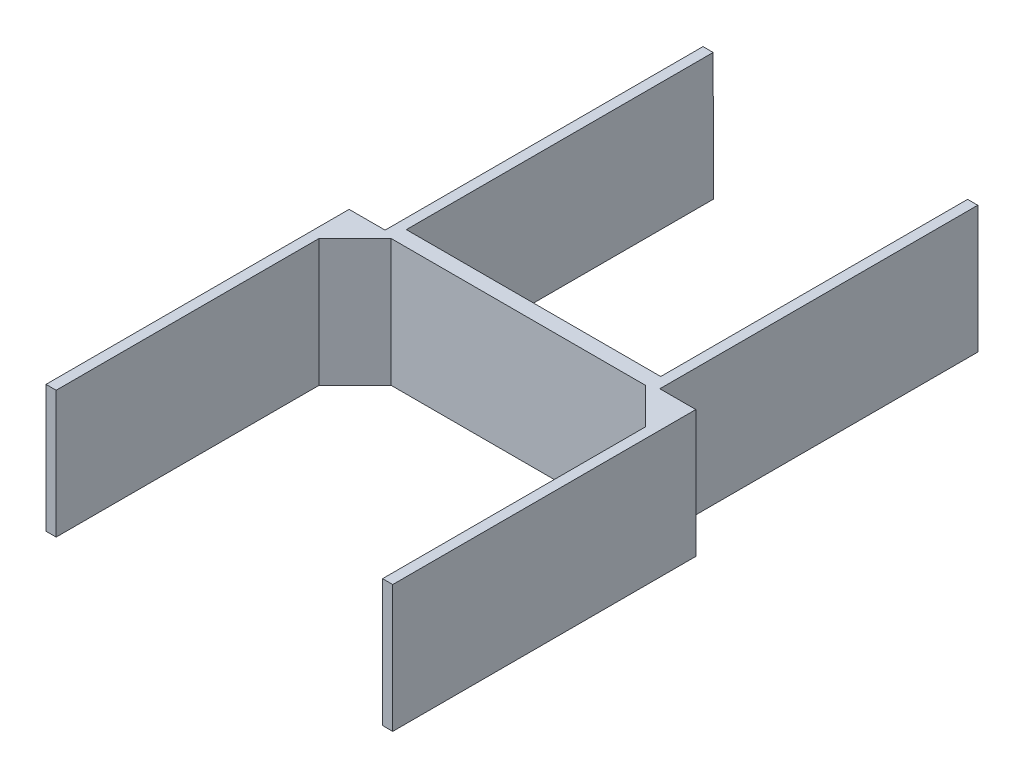
ISO-10303-21;
HEADER;
FILE_DESCRIPTION(('STEP AP214'),'2;1');
FILE_NAME('part.step','',(''),(''),'','','');
FILE_SCHEMA(('AUTOMOTIVE_DESIGN { 1 0 10303 214 1 1 1 1 }'));
ENDSEC;
DATA;
#1=APPLICATION_CONTEXT('core data for automotive mechanical design processes');
#2=APPLICATION_PROTOCOL_DEFINITION('international standard','automotive_design',2000,#1);
#3=PRODUCT_CONTEXT('',#1,'mechanical');
#4=PRODUCT('Part','Part','',(#3));
#5=PRODUCT_RELATED_PRODUCT_CATEGORY('part','',(#4));
#6=PRODUCT_DEFINITION_FORMATION('','',#4);
#7=PRODUCT_DEFINITION_CONTEXT('part definition',#1,'design');
#8=PRODUCT_DEFINITION('design','',#6,#7);
#9=PRODUCT_DEFINITION_SHAPE('','',#8);
#10=(LENGTH_UNIT() NAMED_UNIT(*) SI_UNIT(.MILLI.,.METRE.));
#11=(NAMED_UNIT(*) PLANE_ANGLE_UNIT() SI_UNIT($,.RADIAN.));
#12=(NAMED_UNIT(*) SI_UNIT($,.STERADIAN.) SOLID_ANGLE_UNIT());
#13=UNCERTAINTY_MEASURE_WITH_UNIT(LENGTH_MEASURE(1.E-05),#10,'distance_accuracy_value','');
#14=(GEOMETRIC_REPRESENTATION_CONTEXT(3) GLOBAL_UNCERTAINTY_ASSIGNED_CONTEXT((#13)) GLOBAL_UNIT_ASSIGNED_CONTEXT((#10,
#11,#12)) REPRESENTATION_CONTEXT('',''));
#15=CARTESIAN_POINT('',(0.,0.,0.));
#16=DIRECTION('',(0.,0.,1.));
#17=DIRECTION('',(1.,0.,0.));
#18=AXIS2_PLACEMENT_3D('',#15,#16,#17);
#19=CARTESIAN_POINT('',(-25.,25.,-37.9682734870824));
#20=DIRECTION('',(1.,0.,0.));
#21=DIRECTION('',(0.,0.,-1.));
#22=AXIS2_PLACEMENT_3D('',#19,#20,#21);
#23=PLANE('',#22);
#24=DIRECTION('',(0.,0.,1.));
#25=VECTOR('',#24,1.);
#26=CARTESIAN_POINT('',(-25.,0.,-37.9682734870824));
#27=LINE('',#26,#25);
#28=CARTESIAN_POINT('',(-25.,0.,-50.4916900456021));
#29=VERTEX_POINT('',#28);
#30=CARTESIAN_POINT('',(-25.,0.,9.86015363766381));
#31=VERTEX_POINT('',#30);
#32=EDGE_CURVE('E181',#29,#31,#27,.T.);
#33=ORIENTED_EDGE('',*,*,#32,.F.);
#34=DIRECTION('',(0.,-0.999998423650392,-0.00177558349043893));
#35=VECTOR('',#34,1.);
#36=CARTESIAN_POINT('',(-25.,25.,-50.4473003883675));
#37=LINE('',#36,#35);
#38=CARTESIAN_POINT('',(-25.,25.,-50.4473003883675));
#39=VERTEX_POINT('',#38);
#40=EDGE_CURVE('E281',#39,#29,#37,.T.);
#41=ORIENTED_EDGE('',*,*,#40,.F.);
#42=DIRECTION('',(0.,0.,1.));
#43=VECTOR('',#42,1.);
#44=CARTESIAN_POINT('',(-25.,25.,-37.9682734870824));
#45=LINE('',#44,#43);
#46=CARTESIAN_POINT('',(-25.,25.,9.86015363766381));
#47=VERTEX_POINT('',#46);
#48=EDGE_CURVE('E230',#39,#47,#45,.T.);
#49=ORIENTED_EDGE('',*,*,#48,.T.);
#50=DIRECTION('',(0.,-1.,0.));
#51=VECTOR('',#50,1.);
#52=CARTESIAN_POINT('',(-25.,25.,9.86015363766381));
#53=LINE('',#52,#51);
#54=EDGE_CURVE('E50',#47,#31,#53,.T.);
#55=ORIENTED_EDGE('',*,*,#54,.T.);
#56=EDGE_LOOP('',(#33,#41,#49,#55));
#57=FACE_BOUND('',#56,.T.);
#58=ADVANCED_FACE('F47',(#57),#23,.T.);
#59=CARTESIAN_POINT('',(-27.,25.,12.0317265129176));
#60=DIRECTION('',(-1.,0.,0.));
#61=DIRECTION('',(0.,0.,1.));
#62=AXIS2_PLACEMENT_3D('',#59,#60,#61);
#63=PLANE('',#62);
#64=DIRECTION('',(0.,0.,-1.));
#65=VECTOR('',#64,1.);
#66=CARTESIAN_POINT('',(-27.,0.,12.0317265129176));
#67=LINE('',#66,#65);
#68=CARTESIAN_POINT('',(-27.,0.,12.0317265129176));
#69=VERTEX_POINT('',#68);
#70=CARTESIAN_POINT('',(-27.,0.,-50.4916900456021));
#71=VERTEX_POINT('',#70);
#72=EDGE_CURVE('E227',#69,#71,#67,.T.);
#73=ORIENTED_EDGE('',*,*,#72,.F.);
#74=DIRECTION('',(0.,-1.,0.));
#75=VECTOR('',#74,1.);
#76=CARTESIAN_POINT('',(-27.,25.,12.0317265129176));
#77=LINE('',#76,#75);
#78=CARTESIAN_POINT('',(-27.,25.,12.0317265129176));
#79=VERTEX_POINT('',#78);
#80=EDGE_CURVE('E11',#79,#69,#77,.T.);
#81=ORIENTED_EDGE('',*,*,#80,.F.);
#82=DIRECTION('',(0.,0.,-1.));
#83=VECTOR('',#82,1.);
#84=CARTESIAN_POINT('',(-27.,25.,12.0317265129176));
#85=LINE('',#84,#83);
#86=CARTESIAN_POINT('',(-27.,25.,-50.4473003883675));
#87=VERTEX_POINT('',#86);
#88=EDGE_CURVE('E178',#79,#87,#85,.T.);
#89=ORIENTED_EDGE('',*,*,#88,.T.);
#90=DIRECTION('',(0.,-0.999998423650392,-0.00177558349043893));
#91=VECTOR('',#90,1.);
#92=CARTESIAN_POINT('',(-27.,25.,-50.4473003883675));
#93=LINE('',#92,#91);
#94=EDGE_CURVE('E285',#87,#71,#93,.T.);
#95=ORIENTED_EDGE('',*,*,#94,.T.);
#96=EDGE_LOOP('',(#73,#81,#89,#95));
#97=FACE_BOUND('',#96,.T.);
#98=ADVANCED_FACE('F428',(#97),#63,.T.);
#99=CARTESIAN_POINT('',(-34.0710678118655,25.,12.0317265129176));
#100=DIRECTION('',(0.,0.,-1.));
#101=DIRECTION('',(-1.,0.,0.));
#102=AXIS2_PLACEMENT_3D('',#99,#100,#101);
#103=PLANE('',#102);
#104=DIRECTION('',(1.,0.,0.));
#105=VECTOR('',#104,1.);
#106=CARTESIAN_POINT('',(-34.0710678118655,0.,12.0317265129176));
#107=LINE('',#106,#105);
#108=CARTESIAN_POINT('',(-34.0710678118655,0.,12.0317265129176));
#109=VERTEX_POINT('',#108);
#110=EDGE_CURVE('E223',#109,#69,#107,.T.);
#111=ORIENTED_EDGE('',*,*,#110,.F.);
#112=DIRECTION('',(0.,-1.,0.));
#113=VECTOR('',#112,1.);
#114=CARTESIAN_POINT('',(-34.0710678118655,25.,12.0317265129176));
#115=LINE('',#114,#113);
#116=CARTESIAN_POINT('',(-34.0710678118655,25.,12.0317265129176));
#117=VERTEX_POINT('',#116);
#118=EDGE_CURVE('E57',#117,#109,#115,.T.);
#119=ORIENTED_EDGE('',*,*,#118,.F.);
#120=DIRECTION('',(1.,0.,0.));
#121=VECTOR('',#120,1.);
#122=CARTESIAN_POINT('',(-34.0710678118655,25.,12.0317265129176));
#123=LINE('',#122,#121);
#124=EDGE_CURVE('E175',#117,#79,#123,.T.);
#125=ORIENTED_EDGE('',*,*,#124,.T.);
#126=ORIENTED_EDGE('',*,*,#80,.T.);
#127=EDGE_LOOP('',(#111,#119,#125,#126));
#128=FACE_BOUND('',#127,.T.);
#129=ADVANCED_FACE('F433',(#128),#103,.T.);
#130=CARTESIAN_POINT('',(-34.0710678118655,25.,19.1027943247831));
#131=DIRECTION('',(-1.,0.,0.));
#132=DIRECTION('',(0.,0.,1.));
#133=AXIS2_PLACEMENT_3D('',#130,#131,#132);
#134=PLANE('',#133);
#135=DIRECTION('',(0.,0.,-1.));
#136=VECTOR('',#135,1.);
#137=CARTESIAN_POINT('',(-34.0710678118655,0.,19.1027943247831));
#138=LINE('',#137,#136);
#139=CARTESIAN_POINT('',(-34.0710678118655,0.,71.6027943247831));
#140=VERTEX_POINT('',#139);
#141=EDGE_CURVE('E219',#140,#109,#138,.T.);
#142=ORIENTED_EDGE('',*,*,#141,.F.);
#143=DIRECTION('',(0.,-1.,0.));
#144=VECTOR('',#143,1.);
#145=CARTESIAN_POINT('',(-34.0710678118655,25.,71.6027943247831));
#146=LINE('',#145,#144);
#147=CARTESIAN_POINT('',(-34.0710678118655,25.,71.6027943247831));
#148=VERTEX_POINT('',#147);
#149=EDGE_CURVE('E408',#148,#140,#146,.T.);
#150=ORIENTED_EDGE('',*,*,#149,.F.);
#151=DIRECTION('',(0.,0.,-1.));
#152=VECTOR('',#151,1.);
#153=CARTESIAN_POINT('',(-34.0710678118655,25.,59.1027943247831));
#154=LINE('',#153,#152);
#155=EDGE_CURVE('E161',#148,#117,#154,.T.);
#156=ORIENTED_EDGE('',*,*,#155,.T.);
#157=ORIENTED_EDGE('',*,*,#118,.T.);
#158=EDGE_LOOP('',(#142,#150,#156,#157));
#159=FACE_BOUND('',#158,.T.);
#160=ADVANCED_FACE('F407',(#159),#134,.T.);
#161=CARTESIAN_POINT('',(-32.0710678118655,25.,19.9312214495293));
#162=DIRECTION('',(1.,0.,0.));
#163=DIRECTION('',(0.,0.,-1.));
#164=AXIS2_PLACEMENT_3D('',#161,#162,#163);
#165=PLANE('',#164);
#166=DIRECTION('',(0.,0.,1.));
#167=VECTOR('',#166,1.);
#168=CARTESIAN_POINT('',(-32.0710678118655,0.,19.9312214495293));
#169=LINE('',#168,#167);
#170=CARTESIAN_POINT('',(-32.0710678118655,0.,19.9312214495293));
#171=VERTEX_POINT('',#170);
#172=CARTESIAN_POINT('',(-32.0710678118655,0.,71.6027943247831));
#173=VERTEX_POINT('',#172);
#174=EDGE_CURVE('E143',#171,#173,#169,.T.);
#175=ORIENTED_EDGE('',*,*,#174,.F.);
#176=DIRECTION('',(0.,-1.,0.));
#177=VECTOR('',#176,1.);
#178=CARTESIAN_POINT('',(-32.0710678118655,25.,19.9312214495293));
#179=LINE('',#178,#177);
#180=CARTESIAN_POINT('',(-32.0710678118655,25.,19.9312214495293));
#181=VERTEX_POINT('',#180);
#182=EDGE_CURVE('E135',#181,#171,#179,.T.);
#183=ORIENTED_EDGE('',*,*,#182,.F.);
#184=DIRECTION('',(0.,0.,1.));
#185=VECTOR('',#184,1.);
#186=CARTESIAN_POINT('',(-32.0710678118655,25.,19.9312214495293));
#187=LINE('',#186,#185);
#188=CARTESIAN_POINT('',(-32.0710678118655,25.,71.6027943247831));
#189=VERTEX_POINT('',#188);
#190=EDGE_CURVE('E140',#181,#189,#187,.T.);
#191=ORIENTED_EDGE('',*,*,#190,.T.);
#192=DIRECTION('',(0.,-1.,0.));
#193=VECTOR('',#192,1.);
#194=CARTESIAN_POINT('',(-32.0710678118655,25.,71.6027943247831));
#195=LINE('',#194,#193);
#196=EDGE_CURVE('E414',#189,#173,#195,.T.);
#197=ORIENTED_EDGE('',*,*,#196,.T.);
#198=EDGE_LOOP('',(#175,#183,#191,#197));
#199=FACE_BOUND('',#198,.T.);
#200=ADVANCED_FACE('F137',(#199),#165,.T.);
#201=CARTESIAN_POINT('',(-25.,25.,12.8601536376638));
#202=DIRECTION('',(0.707106781186547,0.,0.707106781186548));
#203=DIRECTION('',(0.707106781186548,0.,-0.707106781186547));
#204=AXIS2_PLACEMENT_3D('',#201,#202,#203);
#205=PLANE('',#204);
#206=DIRECTION('',(-0.707106781186548,0.,0.707106781186547));
#207=VECTOR('',#206,1.);
#208=CARTESIAN_POINT('',(-25.,0.,12.8601536376638));
#209=LINE('',#208,#207);
#210=CARTESIAN_POINT('',(-25.,0.,12.8601536376638));
#211=VERTEX_POINT('',#210);
#212=EDGE_CURVE('E214',#211,#171,#209,.T.);
#213=ORIENTED_EDGE('',*,*,#212,.F.);
#214=DIRECTION('',(0.,-1.,0.));
#215=VECTOR('',#214,1.);
#216=CARTESIAN_POINT('',(-25.,25.,12.8601536376638));
#217=LINE('',#216,#215);
#218=CARTESIAN_POINT('',(-25.,25.,12.8601536376638));
#219=VERTEX_POINT('',#218);
#220=EDGE_CURVE('E149',#219,#211,#217,.T.);
#221=ORIENTED_EDGE('',*,*,#220,.F.);
#222=DIRECTION('',(-0.707106781186548,0.,0.707106781186547));
#223=VECTOR('',#222,1.);
#224=CARTESIAN_POINT('',(-25.,25.,12.8601536376638));
#225=LINE('',#224,#223);
#226=EDGE_CURVE('E155',#219,#181,#225,.T.);
#227=ORIENTED_EDGE('',*,*,#226,.T.);
#228=ORIENTED_EDGE('',*,*,#182,.T.);
#229=EDGE_LOOP('',(#213,#221,#227,#228));
#230=FACE_BOUND('',#229,.T.);
#231=ADVANCED_FACE('F163',(#230),#205,.T.);
#232=CARTESIAN_POINT('',(-25.,25.,12.8601536376638));
#233=DIRECTION('',(0.,0.,-1.));
#234=DIRECTION('',(-1.,0.,0.));
#235=AXIS2_PLACEMENT_3D('',#232,#233,#234);
#236=PLANE('',#235);
#237=DIRECTION('',(1.,0.,0.));
#238=VECTOR('',#237,1.);
#239=CARTESIAN_POINT('',(-25.,0.,12.8601536376638));
#240=LINE('',#239,#238);
#241=CARTESIAN_POINT('',(25.,0.,12.8601536376638));
#242=VERTEX_POINT('',#241);
#243=EDGE_CURVE('E211',#211,#242,#240,.T.);
#244=ORIENTED_EDGE('',*,*,#243,.T.);
#245=DIRECTION('',(0.,-1.,0.));
#246=VECTOR('',#245,1.);
#247=CARTESIAN_POINT('',(25.,25.,12.8601536376638));
#248=LINE('',#247,#246);
#249=CARTESIAN_POINT('',(25.,25.,12.8601536376638));
#250=VERTEX_POINT('',#249);
#251=EDGE_CURVE('E236',#250,#242,#248,.T.);
#252=ORIENTED_EDGE('',*,*,#251,.F.);
#253=DIRECTION('',(1.,0.,0.));
#254=VECTOR('',#253,1.);
#255=CARTESIAN_POINT('',(-25.,25.,12.8601536376638));
#256=LINE('',#255,#254);
#257=EDGE_CURVE('E166',#219,#250,#256,.T.);
#258=ORIENTED_EDGE('',*,*,#257,.F.);
#259=ORIENTED_EDGE('',*,*,#220,.T.);
#260=EDGE_LOOP('',(#244,#252,#258,#259));
#261=FACE_BOUND('',#260,.T.);
#262=ADVANCED_FACE('F448',(#261),#236,.F.);
#263=CARTESIAN_POINT('',(25.,25.,12.8601536376638));
#264=DIRECTION('',(0.707106781186547,0.,-0.707106781186548));
#265=DIRECTION('',(-0.707106781186548,0.,-0.707106781186547));
#266=AXIS2_PLACEMENT_3D('',#263,#264,#265);
#267=PLANE('',#266);
#268=DIRECTION('',(0.707106781186548,0.,0.707106781186547));
#269=VECTOR('',#268,1.);
#270=CARTESIAN_POINT('',(25.,0.,12.8601536376638));
#271=LINE('',#270,#269);
#272=CARTESIAN_POINT('',(32.0710678118655,0.,19.9312214495292));
#273=VERTEX_POINT('',#272);
#274=EDGE_CURVE('E208',#242,#273,#271,.T.);
#275=ORIENTED_EDGE('',*,*,#274,.T.);
#276=DIRECTION('',(0.,-1.,0.));
#277=VECTOR('',#276,1.);
#278=CARTESIAN_POINT('',(32.0710678118655,25.,19.9312214495292));
#279=LINE('',#278,#277);
#280=CARTESIAN_POINT('',(32.0710678118655,25.,19.9312214495292));
#281=VERTEX_POINT('',#280);
#282=EDGE_CURVE('E240',#281,#273,#279,.T.);
#283=ORIENTED_EDGE('',*,*,#282,.F.);
#284=DIRECTION('',(0.707106781186548,0.,0.707106781186547));
#285=VECTOR('',#284,1.);
#286=CARTESIAN_POINT('',(25.,25.,12.8601536376638));
#287=LINE('',#286,#285);
#288=EDGE_CURVE('E169',#250,#281,#287,.T.);
#289=ORIENTED_EDGE('',*,*,#288,.F.);
#290=ORIENTED_EDGE('',*,*,#251,.T.);
#291=EDGE_LOOP('',(#275,#283,#289,#290));
#292=FACE_BOUND('',#291,.T.);
#293=ADVANCED_FACE('F353',(#292),#267,.F.);
#294=CARTESIAN_POINT('',(32.0710678118655,25.,19.9312214495292));
#295=DIRECTION('',(1.,0.,0.));
#296=DIRECTION('',(0.,0.,-1.));
#297=AXIS2_PLACEMENT_3D('',#294,#295,#296);
#298=PLANE('',#297);
#299=DIRECTION('',(0.,0.,1.));
#300=VECTOR('',#299,1.);
#301=CARTESIAN_POINT('',(32.0710678118655,0.,19.9312214495292));
#302=LINE('',#301,#300);
#303=CARTESIAN_POINT('',(32.0710678118655,0.,71.602794324783));
#304=VERTEX_POINT('',#303);
#305=EDGE_CURVE('E204',#273,#304,#302,.T.);
#306=ORIENTED_EDGE('',*,*,#305,.T.);
#307=DIRECTION('',(0.,-1.,0.));
#308=VECTOR('',#307,1.);
#309=CARTESIAN_POINT('',(32.0710678118655,25.,71.602794324783));
#310=LINE('',#309,#308);
#311=CARTESIAN_POINT('',(32.0710678118655,25.,71.602794324783));
#312=VERTEX_POINT('',#311);
#313=EDGE_CURVE('E310',#312,#304,#310,.T.);
#314=ORIENTED_EDGE('',*,*,#313,.F.);
#315=DIRECTION('',(0.,0.,1.));
#316=VECTOR('',#315,1.);
#317=CARTESIAN_POINT('',(32.0710678118655,25.,19.9312214495292));
#318=LINE('',#317,#316);
#319=EDGE_CURVE('E342',#281,#312,#318,.T.);
#320=ORIENTED_EDGE('',*,*,#319,.F.);
#321=ORIENTED_EDGE('',*,*,#282,.T.);
#322=EDGE_LOOP('',(#306,#314,#320,#321));
#323=FACE_BOUND('',#322,.T.);
#324=ADVANCED_FACE('F358',(#323),#298,.F.);
#325=CARTESIAN_POINT('',(34.0710678118655,25.,59.102794324783));
#326=DIRECTION('',(-1.,0.,0.));
#327=DIRECTION('',(0.,0.,1.));
#328=AXIS2_PLACEMENT_3D('',#325,#326,#327);
#329=PLANE('',#328);
#330=DIRECTION('',(0.,0.,-1.));
#331=VECTOR('',#330,1.);
#332=CARTESIAN_POINT('',(34.0710678118655,0.,59.102794324783));
#333=LINE('',#332,#331);
#334=CARTESIAN_POINT('',(34.0710678118655,0.,71.602794324783));
#335=VERTEX_POINT('',#334);
#336=CARTESIAN_POINT('',(34.0710678118655,0.,12.0317265129176));
#337=VERTEX_POINT('',#336);
#338=EDGE_CURVE('E200',#335,#337,#333,.T.);
#339=ORIENTED_EDGE('',*,*,#338,.T.);
#340=DIRECTION('',(0.,-1.,0.));
#341=VECTOR('',#340,1.);
#342=CARTESIAN_POINT('',(34.0710678118655,25.,12.0317265129176));
#343=LINE('',#342,#341);
#344=CARTESIAN_POINT('',(34.0710678118655,25.,12.0317265129176));
#345=VERTEX_POINT('',#344);
#346=EDGE_CURVE('E244',#345,#337,#343,.T.);
#347=ORIENTED_EDGE('',*,*,#346,.F.);
#348=DIRECTION('',(0.,0.,1.));
#349=VECTOR('',#348,1.);
#350=CARTESIAN_POINT('',(34.0710678118655,25.,12.0317265129176));
#351=LINE('',#350,#349);
#352=CARTESIAN_POINT('',(34.0710678118655,25.,71.602794324783));
#353=VERTEX_POINT('',#352);
#354=EDGE_CURVE('E338',#345,#353,#351,.T.);
#355=ORIENTED_EDGE('',*,*,#354,.T.);
#356=DIRECTION('',(0.,-1.,0.));
#357=VECTOR('',#356,1.);
#358=CARTESIAN_POINT('',(34.0710678118655,25.,71.602794324783));
#359=LINE('',#358,#357);
#360=EDGE_CURVE('E306',#353,#335,#359,.T.);
#361=ORIENTED_EDGE('',*,*,#360,.T.);
#362=EDGE_LOOP('',(#339,#347,#355,#361));
#363=FACE_BOUND('',#362,.T.);
#364=ADVANCED_FACE('F456',(#363),#329,.F.);
#365=CARTESIAN_POINT('',(27.,25.,12.0317265129176));
#366=DIRECTION('',(0.,0.,-1.));
#367=DIRECTION('',(-1.,0.,0.));
#368=AXIS2_PLACEMENT_3D('',#365,#366,#367);
#369=PLANE('',#368);
#370=ORIENTED_EDGE('',*,*,#346,.T.);
#371=DIRECTION('',(1.,0.,0.));
#372=VECTOR('',#371,1.);
#373=CARTESIAN_POINT('',(27.,0.,12.0317265129176));
#374=LINE('',#373,#372);
#375=CARTESIAN_POINT('',(27.,0.,12.0317265129176));
#376=VERTEX_POINT('',#375);
#377=EDGE_CURVE('E197',#376,#337,#374,.T.);
#378=ORIENTED_EDGE('',*,*,#377,.F.);
#379=DIRECTION('',(0.,-1.,0.));
#380=VECTOR('',#379,1.);
#381=CARTESIAN_POINT('',(27.,25.,12.0317265129176));
#382=LINE('',#381,#380);
#383=CARTESIAN_POINT('',(27.,25.,12.0317265129176));
#384=VERTEX_POINT('',#383);
#385=EDGE_CURVE('E248',#384,#376,#382,.T.);
#386=ORIENTED_EDGE('',*,*,#385,.F.);
#387=DIRECTION('',(1.,0.,0.));
#388=VECTOR('',#387,1.);
#389=CARTESIAN_POINT('',(27.,25.,12.0317265129176));
#390=LINE('',#389,#388);
#391=EDGE_CURVE('E335',#384,#345,#390,.T.);
#392=ORIENTED_EDGE('',*,*,#391,.T.);
#393=EDGE_LOOP('',(#370,#378,#386,#392));
#394=FACE_BOUND('',#393,.T.);
#395=ADVANCED_FACE('F459',(#394),#369,.T.);
#396=CARTESIAN_POINT('',(27.,25.,12.0317265129176));
#397=DIRECTION('',(-1.,0.,0.));
#398=DIRECTION('',(0.,0.,1.));
#399=AXIS2_PLACEMENT_3D('',#396,#397,#398);
#400=PLANE('',#399);
#401=DIRECTION('',(0.,0.,-1.));
#402=VECTOR('',#401,1.);
#403=CARTESIAN_POINT('',(27.,0.,12.0317265129176));
#404=LINE('',#403,#402);
#405=CARTESIAN_POINT('',(27.,0.,-50.4916900456021));
#406=VERTEX_POINT('',#405);
#407=EDGE_CURVE('E193',#376,#406,#404,.T.);
#408=ORIENTED_EDGE('',*,*,#407,.T.);
#409=DIRECTION('',(0.,0.999998423650392,0.00177558349043893));
#410=VECTOR('',#409,1.);
#411=CARTESIAN_POINT('',(27.,25.,-50.4473003883675));
#412=LINE('',#411,#410);
#413=CARTESIAN_POINT('',(27.,25.,-50.4473003883675));
#414=VERTEX_POINT('',#413);
#415=EDGE_CURVE('E277',#406,#414,#412,.T.);
#416=ORIENTED_EDGE('',*,*,#415,.T.);
#417=DIRECTION('',(0.,0.,-1.));
#418=VECTOR('',#417,1.);
#419=CARTESIAN_POINT('',(27.,25.,12.0317265129176));
#420=LINE('',#419,#418);
#421=EDGE_CURVE('E332',#384,#414,#420,.T.);
#422=ORIENTED_EDGE('',*,*,#421,.F.);
#423=ORIENTED_EDGE('',*,*,#385,.T.);
#424=EDGE_LOOP('',(#408,#416,#422,#423));
#425=FACE_BOUND('',#424,.T.);
#426=ADVANCED_FACE('F389',(#425),#400,.F.);
#427=CARTESIAN_POINT('',(25.,25.,-37.9682734870824));
#428=DIRECTION('',(1.,0.,0.));
#429=DIRECTION('',(0.,0.,-1.));
#430=AXIS2_PLACEMENT_3D('',#427,#428,#429);
#431=PLANE('',#430);
#432=DIRECTION('',(0.,-1.,0.));
#433=VECTOR('',#432,1.);
#434=CARTESIAN_POINT('',(25.,25.,9.86015363766375));
#435=LINE('',#434,#433);
#436=CARTESIAN_POINT('',(25.,25.,9.86015363766375));
#437=VERTEX_POINT('',#436);
#438=CARTESIAN_POINT('',(25.,0.,9.86015363766375));
#439=VERTEX_POINT('',#438);
#440=EDGE_CURVE('E250',#437,#439,#435,.T.);
#441=ORIENTED_EDGE('',*,*,#440,.F.);
#442=DIRECTION('',(0.,0.,1.));
#443=VECTOR('',#442,1.);
#444=CARTESIAN_POINT('',(25.,25.,-37.9682734870824));
#445=LINE('',#444,#443);
#446=CARTESIAN_POINT('',(25.,25.,-50.4473003883675));
#447=VERTEX_POINT('',#446);
#448=EDGE_CURVE('E329',#447,#437,#445,.T.);
#449=ORIENTED_EDGE('',*,*,#448,.F.);
#450=DIRECTION('',(0.,0.999998423650392,0.00177558349043893));
#451=VECTOR('',#450,1.);
#452=CARTESIAN_POINT('',(25.,25.,-50.4473003883675));
#453=LINE('',#452,#451);
#454=CARTESIAN_POINT('',(25.,0.,-50.4916900456021));
#455=VERTEX_POINT('',#454);
#456=EDGE_CURVE('E294',#455,#447,#453,.T.);
#457=ORIENTED_EDGE('',*,*,#456,.F.);
#458=DIRECTION('',(0.,0.,1.));
#459=VECTOR('',#458,1.);
#460=CARTESIAN_POINT('',(25.,0.,-37.9682734870824));
#461=LINE('',#460,#459);
#462=EDGE_CURVE('E190',#455,#439,#461,.T.);
#463=ORIENTED_EDGE('',*,*,#462,.T.);
#464=EDGE_LOOP('',(#441,#449,#457,#463));
#465=FACE_BOUND('',#464,.T.);
#466=ADVANCED_FACE('F392',(#465),#431,.F.);
#467=CARTESIAN_POINT('',(-25.,25.,9.86015363766381));
#468=DIRECTION('',(0.,0.,-1.));
#469=DIRECTION('',(-1.,0.,0.));
#470=AXIS2_PLACEMENT_3D('',#467,#468,#469);
#471=PLANE('',#470);
#472=DIRECTION('',(1.,0.,0.));
#473=VECTOR('',#472,1.);
#474=CARTESIAN_POINT('',(-25.,0.,9.86015363766381));
#475=LINE('',#474,#473);
#476=EDGE_CURVE('E185',#31,#439,#475,.T.);
#477=ORIENTED_EDGE('',*,*,#476,.F.);
#478=ORIENTED_EDGE('',*,*,#54,.F.);
#479=DIRECTION('',(1.,0.,0.));
#480=VECTOR('',#479,1.);
#481=CARTESIAN_POINT('',(-25.,25.,9.86015363766381));
#482=LINE('',#481,#480);
#483=EDGE_CURVE('E326',#47,#437,#482,.T.);
#484=ORIENTED_EDGE('',*,*,#483,.T.);
#485=ORIENTED_EDGE('',*,*,#440,.T.);
#486=EDGE_LOOP('',(#477,#478,#484,#485));
#487=FACE_BOUND('',#486,.T.);
#488=ADVANCED_FACE('F262',(#487),#471,.T.);
#489=CARTESIAN_POINT('',(0.,25.,0.));
#490=DIRECTION('',(0.,1.,0.));
#491=DIRECTION('',(0.,0.,1.));
#492=AXIS2_PLACEMENT_3D('',#489,#490,#491);
#493=PLANE('',#492);
#494=ORIENTED_EDGE('',*,*,#421,.T.);
#495=DIRECTION('',(1.,0.,0.));
#496=VECTOR('',#495,1.);
#497=CARTESIAN_POINT('',(25.,25.,-50.4473003883675));
#498=LINE('',#497,#496);
#499=EDGE_CURVE('E302',#447,#414,#498,.T.);
#500=ORIENTED_EDGE('',*,*,#499,.F.);
#501=ORIENTED_EDGE('',*,*,#448,.T.);
#502=ORIENTED_EDGE('',*,*,#483,.F.);
#503=ORIENTED_EDGE('',*,*,#48,.F.);
#504=DIRECTION('',(-1.,0.,0.));
#505=VECTOR('',#504,1.);
#506=CARTESIAN_POINT('',(-25.,25.,-50.4473003883675));
#507=LINE('',#506,#505);
#508=EDGE_CURVE('E278',#39,#87,#507,.T.);
#509=ORIENTED_EDGE('',*,*,#508,.T.);
#510=ORIENTED_EDGE('',*,*,#88,.F.);
#511=ORIENTED_EDGE('',*,*,#124,.F.);
#512=ORIENTED_EDGE('',*,*,#155,.F.);
#513=DIRECTION('',(-1.,0.,0.));
#514=VECTOR('',#513,1.);
#515=CARTESIAN_POINT('',(-32.0710678118655,25.,71.6027943247831));
#516=LINE('',#515,#514);
#517=EDGE_CURVE('E158',#189,#148,#516,.T.);
#518=ORIENTED_EDGE('',*,*,#517,.F.);
#519=ORIENTED_EDGE('',*,*,#190,.F.);
#520=ORIENTED_EDGE('',*,*,#226,.F.);
#521=ORIENTED_EDGE('',*,*,#257,.T.);
#522=ORIENTED_EDGE('',*,*,#288,.T.);
#523=ORIENTED_EDGE('',*,*,#319,.T.);
#524=DIRECTION('',(1.,0.,0.));
#525=VECTOR('',#524,1.);
#526=CARTESIAN_POINT('',(32.0710678118655,25.,71.602794324783));
#527=LINE('',#526,#525);
#528=EDGE_CURVE('E314',#312,#353,#527,.T.);
#529=ORIENTED_EDGE('',*,*,#528,.T.);
#530=ORIENTED_EDGE('',*,*,#354,.F.);
#531=ORIENTED_EDGE('',*,*,#391,.F.);
#532=EDGE_LOOP('',(#494,#500,#501,#502,#503,#509,#510,#511,#512,#518,#519,#520,#521,#522,#523,
#529,#530,#531));
#533=FACE_BOUND('',#532,.T.);
#534=ADVANCED_FACE('F154',(#533),#493,.T.);
#535=CARTESIAN_POINT('',(0.,0.,0.));
#536=DIRECTION('',(0.,1.,0.));
#537=DIRECTION('',(0.,0.,1.));
#538=AXIS2_PLACEMENT_3D('',#535,#536,#537);
#539=PLANE('',#538);
#540=ORIENTED_EDGE('',*,*,#476,.T.);
#541=ORIENTED_EDGE('',*,*,#462,.F.);
#542=DIRECTION('',(1.,0.,0.));
#543=VECTOR('',#542,1.);
#544=CARTESIAN_POINT('',(25.,0.,-50.4916900456021));
#545=LINE('',#544,#543);
#546=EDGE_CURVE('E298',#455,#406,#545,.T.);
#547=ORIENTED_EDGE('',*,*,#546,.T.);
#548=ORIENTED_EDGE('',*,*,#407,.F.);
#549=ORIENTED_EDGE('',*,*,#377,.T.);
#550=ORIENTED_EDGE('',*,*,#338,.F.);
#551=DIRECTION('',(1.,0.,0.));
#552=VECTOR('',#551,1.);
#553=CARTESIAN_POINT('',(32.0710678118655,0.,71.602794324783));
#554=LINE('',#553,#552);
#555=EDGE_CURVE('E186',#304,#335,#554,.T.);
#556=ORIENTED_EDGE('',*,*,#555,.F.);
#557=ORIENTED_EDGE('',*,*,#305,.F.);
#558=ORIENTED_EDGE('',*,*,#274,.F.);
#559=ORIENTED_EDGE('',*,*,#243,.F.);
#560=ORIENTED_EDGE('',*,*,#212,.T.);
#561=ORIENTED_EDGE('',*,*,#174,.T.);
#562=DIRECTION('',(-1.,0.,0.));
#563=VECTOR('',#562,1.);
#564=CARTESIAN_POINT('',(-32.0710678118655,0.,71.6027943247831));
#565=LINE('',#564,#563);
#566=EDGE_CURVE('E412',#173,#140,#565,.T.);
#567=ORIENTED_EDGE('',*,*,#566,.T.);
#568=ORIENTED_EDGE('',*,*,#141,.T.);
#569=ORIENTED_EDGE('',*,*,#110,.T.);
#570=ORIENTED_EDGE('',*,*,#72,.T.);
#571=DIRECTION('',(-1.,0.,0.));
#572=VECTOR('',#571,1.);
#573=CARTESIAN_POINT('',(-25.,0.,-50.4916900456021));
#574=LINE('',#573,#572);
#575=EDGE_CURVE('E267',#29,#71,#574,.T.);
#576=ORIENTED_EDGE('',*,*,#575,.F.);
#577=ORIENTED_EDGE('',*,*,#32,.T.);
#578=EDGE_LOOP('',(#540,#541,#547,#548,#549,#550,#556,#557,#558,#559,#560,#561,#567,#568,#569,
#570,#576,#577));
#579=FACE_BOUND('',#578,.T.);
#580=ADVANCED_FACE('F265',(#579),#539,.F.);
#581=CARTESIAN_POINT('',(32.0710678118655,25.,71.602794324783));
#582=DIRECTION('',(0.,0.,1.));
#583=DIRECTION('',(1.,0.,0.));
#584=AXIS2_PLACEMENT_3D('',#581,#582,#583);
#585=PLANE('',#584);
#586=ORIENTED_EDGE('',*,*,#360,.F.);
#587=ORIENTED_EDGE('',*,*,#528,.F.);
#588=ORIENTED_EDGE('',*,*,#313,.T.);
#589=ORIENTED_EDGE('',*,*,#555,.T.);
#590=EDGE_LOOP('',(#586,#587,#588,#589));
#591=FACE_BOUND('',#590,.T.);
#592=ADVANCED_FACE('F363',(#591),#585,.T.);
#593=CARTESIAN_POINT('',(25.,25.,-50.4473003883675));
#594=DIRECTION('',(0.,0.00177558349043893,-0.999998423650392));
#595=DIRECTION('',(0.,0.999998423650392,0.00177558349043893));
#596=AXIS2_PLACEMENT_3D('',#593,#594,#595);
#597=PLANE('',#596);
#598=ORIENTED_EDGE('',*,*,#415,.F.);
#599=ORIENTED_EDGE('',*,*,#546,.F.);
#600=ORIENTED_EDGE('',*,*,#456,.T.);
#601=ORIENTED_EDGE('',*,*,#499,.T.);
#602=EDGE_LOOP('',(#598,#599,#600,#601));
#603=FACE_BOUND('',#602,.T.);
#604=ADVANCED_FACE('F387',(#603),#597,.T.);
#605=CARTESIAN_POINT('',(-25.,25.,-50.4473003883675));
#606=DIRECTION('',(0.,0.00177558349043893,-0.999998423650392));
#607=DIRECTION('',(0.,0.999998423650392,0.00177558349043893));
#608=AXIS2_PLACEMENT_3D('',#605,#606,#607);
#609=PLANE('',#608);
#610=ORIENTED_EDGE('',*,*,#94,.F.);
#611=ORIENTED_EDGE('',*,*,#508,.F.);
#612=ORIENTED_EDGE('',*,*,#40,.T.);
#613=ORIENTED_EDGE('',*,*,#575,.T.);
#614=EDGE_LOOP('',(#610,#611,#612,#613));
#615=FACE_BOUND('',#614,.T.);
#616=ADVANCED_FACE('F282',(#615),#609,.T.);
#617=CARTESIAN_POINT('',(-32.0710678118655,25.,71.6027943247831));
#618=DIRECTION('',(0.,0.,-1.));
#619=DIRECTION('',(0.,1.,0.));
#620=AXIS2_PLACEMENT_3D('',#617,#618,#619);
#621=PLANE('',#620);
#622=ORIENTED_EDGE('',*,*,#149,.T.);
#623=ORIENTED_EDGE('',*,*,#566,.F.);
#624=ORIENTED_EDGE('',*,*,#196,.F.);
#625=ORIENTED_EDGE('',*,*,#517,.T.);
#626=EDGE_LOOP('',(#622,#623,#624,#625));
#627=FACE_BOUND('',#626,.T.);
#628=ADVANCED_FACE('F411',(#627),#621,.F.);
#629=CLOSED_SHELL('',(#58,#98,#129,#160,#200,#231,#262,#293,#324,#364,#395,#426,#466,#488,#534,
#580,#592,#604,#616,#628));
#630=MANIFOLD_SOLID_BREP('B2',#629);
#631=ADVANCED_BREP_SHAPE_REPRESENTATION('',(#18,#630),#14);
#632=SHAPE_DEFINITION_REPRESENTATION(#9,#631);
ENDSEC;
END-ISO-10303-21;
